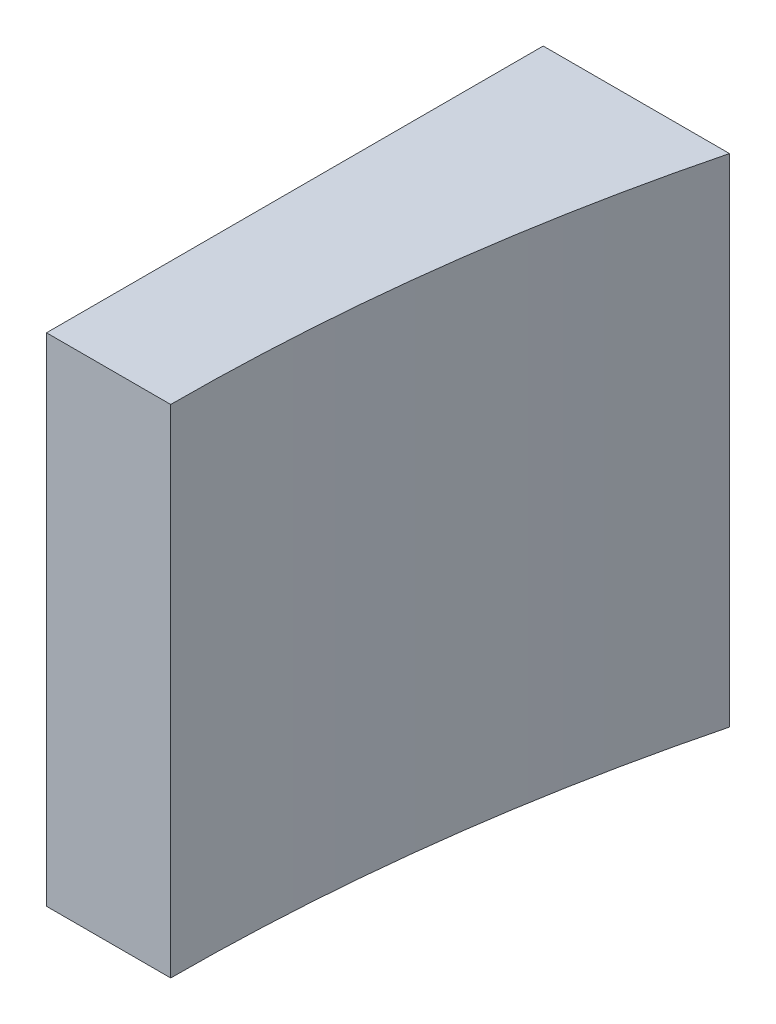
ISO-10303-21;
HEADER;
FILE_DESCRIPTION(('STEP AP214'),'2;1');
FILE_NAME('part.step','',(''),(''),'','','');
FILE_SCHEMA(('AUTOMOTIVE_DESIGN { 1 0 10303 214 1 1 1 1 }'));
ENDSEC;
DATA;
#1=APPLICATION_CONTEXT('core data for automotive mechanical design processes');
#2=APPLICATION_PROTOCOL_DEFINITION('international standard','automotive_design',2000,#1);
#3=PRODUCT_CONTEXT('',#1,'mechanical');
#4=PRODUCT('Part','Part','',(#3));
#5=PRODUCT_RELATED_PRODUCT_CATEGORY('part','',(#4));
#6=PRODUCT_DEFINITION_FORMATION('','',#4);
#7=PRODUCT_DEFINITION_CONTEXT('part definition',#1,'design');
#8=PRODUCT_DEFINITION('design','',#6,#7);
#9=PRODUCT_DEFINITION_SHAPE('','',#8);
#10=(LENGTH_UNIT() NAMED_UNIT(*) SI_UNIT(.MILLI.,.METRE.));
#11=(NAMED_UNIT(*) PLANE_ANGLE_UNIT() SI_UNIT($,.RADIAN.));
#12=(NAMED_UNIT(*) SI_UNIT($,.STERADIAN.) SOLID_ANGLE_UNIT());
#13=UNCERTAINTY_MEASURE_WITH_UNIT(LENGTH_MEASURE(1.E-05),#10,'distance_accuracy_value','');
#14=(GEOMETRIC_REPRESENTATION_CONTEXT(3) GLOBAL_UNCERTAINTY_ASSIGNED_CONTEXT((#13)) GLOBAL_UNIT_ASSIGNED_CONTEXT((#10,
#11,#12)) REPRESENTATION_CONTEXT('',''));
#15=CARTESIAN_POINT('',(0.,0.,0.));
#16=DIRECTION('',(0.,0.,1.));
#17=DIRECTION('',(1.,0.,0.));
#18=AXIS2_PLACEMENT_3D('',#15,#16,#17);
#19=CARTESIAN_POINT('',(0.,50.8,25.4));
#20=DIRECTION('',(0.,0.,-1.));
#21=DIRECTION('',(1.,0.,0.));
#22=AXIS2_PLACEMENT_3D('',#19,#20,#21);
#23=PLANE('',#22);
#24=DIRECTION('',(-1.,0.,0.));
#25=VECTOR('',#24,1.);
#26=CARTESIAN_POINT('',(0.,0.,25.4));
#27=LINE('',#26,#25);
#28=CARTESIAN_POINT('',(12.7,0.,25.4));
#29=VERTEX_POINT('',#28);
#30=CARTESIAN_POINT('',(0.,0.,25.4));
#31=VERTEX_POINT('',#30);
#32=EDGE_CURVE('E114',#29,#31,#27,.T.);
#33=ORIENTED_EDGE('',*,*,#32,.F.);
#34=DIRECTION('',(0.,-1.,0.));
#35=VECTOR('',#34,1.);
#36=CARTESIAN_POINT('',(12.7,50.8,25.4));
#37=LINE('',#36,#35);
#38=CARTESIAN_POINT('',(12.7,50.8,25.4));
#39=VERTEX_POINT('',#38);
#40=EDGE_CURVE('E113',#39,#29,#37,.T.);
#41=ORIENTED_EDGE('',*,*,#40,.F.);
#42=DIRECTION('',(-1.,0.,0.));
#43=VECTOR('',#42,1.);
#44=CARTESIAN_POINT('',(0.,50.8,25.4));
#45=LINE('',#44,#43);
#46=CARTESIAN_POINT('',(0.,50.8,25.4));
#47=VERTEX_POINT('',#46);
#48=EDGE_CURVE('E106',#39,#47,#45,.T.);
#49=ORIENTED_EDGE('',*,*,#48,.T.);
#50=DIRECTION('',(0.,-1.,0.));
#51=VECTOR('',#50,1.);
#52=CARTESIAN_POINT('',(0.,50.8,25.4));
#53=LINE('',#52,#51);
#54=EDGE_CURVE('E11',#47,#31,#53,.T.);
#55=ORIENTED_EDGE('',*,*,#54,.T.);
#56=EDGE_LOOP('',(#33,#41,#49,#55));
#57=FACE_BOUND('',#56,.T.);
#58=ADVANCED_FACE('F45',(#57),#23,.F.);
#59=CARTESIAN_POINT('',(0.,50.8,-25.4));
#60=DIRECTION('',(1.,0.,0.));
#61=DIRECTION('',(0.,0.,1.));
#62=AXIS2_PLACEMENT_3D('',#59,#60,#61);
#63=PLANE('',#62);
#64=DIRECTION('',(0.,0.,-1.));
#65=VECTOR('',#64,1.);
#66=CARTESIAN_POINT('',(0.,0.,-25.4));
#67=LINE('',#66,#65);
#68=CARTESIAN_POINT('',(0.,0.,-25.4));
#69=VERTEX_POINT('',#68);
#70=EDGE_CURVE('E116',#31,#69,#67,.T.);
#71=ORIENTED_EDGE('',*,*,#70,.F.);
#72=ORIENTED_EDGE('',*,*,#54,.F.);
#73=DIRECTION('',(0.,0.,-1.));
#74=VECTOR('',#73,1.);
#75=CARTESIAN_POINT('',(0.,50.8,-25.4));
#76=LINE('',#75,#74);
#77=CARTESIAN_POINT('',(0.,50.8,-25.4));
#78=VERTEX_POINT('',#77);
#79=EDGE_CURVE('E89',#47,#78,#76,.T.);
#80=ORIENTED_EDGE('',*,*,#79,.T.);
#81=DIRECTION('',(0.,-1.,0.));
#82=VECTOR('',#81,1.);
#83=CARTESIAN_POINT('',(0.,50.8,-25.4));
#84=LINE('',#83,#82);
#85=EDGE_CURVE('E54',#78,#69,#84,.T.);
#86=ORIENTED_EDGE('',*,*,#85,.T.);
#87=EDGE_LOOP('',(#71,#72,#80,#86));
#88=FACE_BOUND('',#87,.T.);
#89=ADVANCED_FACE('F103',(#88),#63,.F.);
#90=CARTESIAN_POINT('',(0.,50.8,-25.4));
#91=DIRECTION('',(0.,0.,1.));
#92=DIRECTION('',(-1.,0.,0.));
#93=AXIS2_PLACEMENT_3D('',#90,#91,#92);
#94=PLANE('',#93);
#95=DIRECTION('',(1.,0.,0.));
#96=VECTOR('',#95,1.);
#97=CARTESIAN_POINT('',(0.,0.,-25.4));
#98=LINE('',#97,#96);
#99=CARTESIAN_POINT('',(19.05,0.,-25.4));
#100=VERTEX_POINT('',#99);
#101=EDGE_CURVE('E99',#69,#100,#98,.T.);
#102=ORIENTED_EDGE('',*,*,#101,.F.);
#103=ORIENTED_EDGE('',*,*,#85,.F.);
#104=DIRECTION('',(1.,0.,0.));
#105=VECTOR('',#104,1.);
#106=CARTESIAN_POINT('',(0.,50.8,-25.4));
#107=LINE('',#106,#105);
#108=CARTESIAN_POINT('',(19.05,50.8,-25.4));
#109=VERTEX_POINT('',#108);
#110=EDGE_CURVE('E92',#78,#109,#107,.T.);
#111=ORIENTED_EDGE('',*,*,#110,.T.);
#112=DIRECTION('',(0.,-1.,0.));
#113=VECTOR('',#112,1.);
#114=CARTESIAN_POINT('',(19.05,50.8,-25.4));
#115=LINE('',#114,#113);
#116=EDGE_CURVE('E102',#109,#100,#115,.T.);
#117=ORIENTED_EDGE('',*,*,#116,.T.);
#118=EDGE_LOOP('',(#102,#103,#111,#117));
#119=FACE_BOUND('',#118,.T.);
#120=ADVANCED_FACE('F98',(#119),#94,.F.);
#121=CARTESIAN_POINT('',(219.075000000001,50.8,25.4));
#122=DIRECTION('',(0.,-1.,0.));
#123=DIRECTION('',(0.,0.,1.));
#124=AXIS2_PLACEMENT_3D('',#121,#122,#123);
#125=CYLINDRICAL_SURFACE('',#124,206.375000000001);
#126=CARTESIAN_POINT('',(219.075000000001,0.,25.4));
#127=DIRECTION('',(0.,1.,0.));
#128=DIRECTION('',(0.,0.,-1.));
#129=AXIS2_PLACEMENT_3D('',#126,#127,#128);
#130=CIRCLE('',#129,206.375000000001);
#131=EDGE_CURVE('E78',#100,#29,#130,.T.);
#132=ORIENTED_EDGE('',*,*,#131,.F.);
#133=ORIENTED_EDGE('',*,*,#116,.F.);
#134=CARTESIAN_POINT('',(219.075000000001,50.8,25.4));
#135=DIRECTION('',(0.,1.,0.));
#136=DIRECTION('',(0.,0.,-1.));
#137=AXIS2_PLACEMENT_3D('',#134,#135,#136);
#138=CIRCLE('',#137,206.375000000001);
#139=EDGE_CURVE('E64',#109,#39,#138,.T.);
#140=ORIENTED_EDGE('',*,*,#139,.T.);
#141=ORIENTED_EDGE('',*,*,#40,.T.);
#142=EDGE_LOOP('',(#132,#133,#140,#141));
#143=FACE_BOUND('',#142,.T.);
#144=ADVANCED_FACE('F126',(#143),#125,.F.);
#145=CARTESIAN_POINT('',(219.075000000001,50.8,25.4));
#146=DIRECTION('',(0.,1.,0.));
#147=DIRECTION('',(0.,0.,-1.));
#148=AXIS2_PLACEMENT_3D('',#145,#146,#147);
#149=PLANE('',#148);
#150=ORIENTED_EDGE('',*,*,#48,.F.);
#151=ORIENTED_EDGE('',*,*,#139,.F.);
#152=ORIENTED_EDGE('',*,*,#110,.F.);
#153=ORIENTED_EDGE('',*,*,#79,.F.);
#154=EDGE_LOOP('',(#150,#151,#152,#153));
#155=FACE_BOUND('',#154,.T.);
#156=ADVANCED_FACE('F94',(#155),#149,.T.);
#157=CARTESIAN_POINT('',(219.075000000001,0.,25.4));
#158=DIRECTION('',(0.,1.,0.));
#159=DIRECTION('',(0.,0.,-1.));
#160=AXIS2_PLACEMENT_3D('',#157,#158,#159);
#161=PLANE('',#160);
#162=ORIENTED_EDGE('',*,*,#32,.T.);
#163=ORIENTED_EDGE('',*,*,#70,.T.);
#164=ORIENTED_EDGE('',*,*,#101,.T.);
#165=ORIENTED_EDGE('',*,*,#131,.T.);
#166=EDGE_LOOP('',(#162,#163,#164,#165));
#167=FACE_BOUND('',#166,.T.);
#168=ADVANCED_FACE('F122',(#167),#161,.F.);
#169=CLOSED_SHELL('',(#58,#89,#120,#144,#156,#168));
#170=MANIFOLD_SOLID_BREP('B2',#169);
#171=ADVANCED_BREP_SHAPE_REPRESENTATION('',(#18,#170),#14);
#172=SHAPE_DEFINITION_REPRESENTATION(#9,#171);
ENDSEC;
END-ISO-10303-21;
